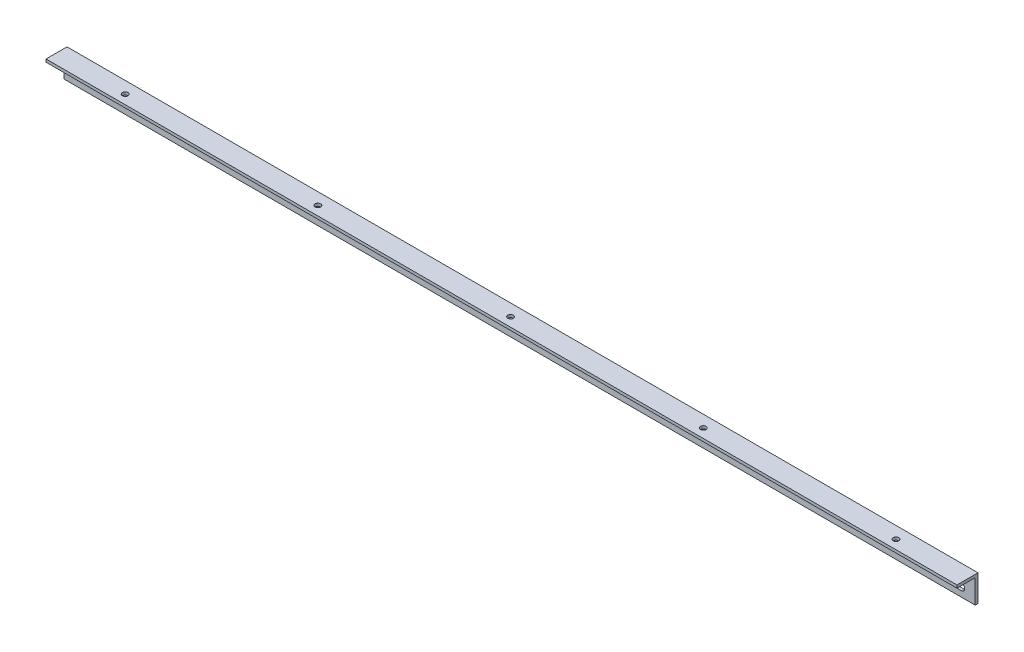
ISO-10303-21;
HEADER;
FILE_DESCRIPTION(('STEP AP214'),'2;1');
FILE_NAME('part.step','',(''),(''),'','','');
FILE_SCHEMA(('AUTOMOTIVE_DESIGN { 1 0 10303 214 1 1 1 1 }'));
ENDSEC;
DATA;
#1=APPLICATION_CONTEXT('core data for automotive mechanical design processes');
#2=APPLICATION_PROTOCOL_DEFINITION('international standard','automotive_design',2000,#1);
#3=PRODUCT_CONTEXT('',#1,'mechanical');
#4=PRODUCT('Part','Part','',(#3));
#5=PRODUCT_RELATED_PRODUCT_CATEGORY('part','',(#4));
#6=PRODUCT_DEFINITION_FORMATION('','',#4);
#7=PRODUCT_DEFINITION_CONTEXT('part definition',#1,'design');
#8=PRODUCT_DEFINITION('design','',#6,#7);
#9=PRODUCT_DEFINITION_SHAPE('','',#8);
#10=(LENGTH_UNIT() NAMED_UNIT(*) SI_UNIT(.MILLI.,.METRE.));
#11=(NAMED_UNIT(*) PLANE_ANGLE_UNIT() SI_UNIT($,.RADIAN.));
#12=(NAMED_UNIT(*) SI_UNIT($,.STERADIAN.) SOLID_ANGLE_UNIT());
#13=UNCERTAINTY_MEASURE_WITH_UNIT(LENGTH_MEASURE(1.E-05),#10,'distance_accuracy_value','');
#14=(GEOMETRIC_REPRESENTATION_CONTEXT(3) GLOBAL_UNCERTAINTY_ASSIGNED_CONTEXT((#13)) GLOBAL_UNIT_ASSIGNED_CONTEXT((#10,
#11,#12)) REPRESENTATION_CONTEXT('',''));
#15=CARTESIAN_POINT('',(0.,0.,0.));
#16=DIRECTION('',(0.,0.,1.));
#17=DIRECTION('',(1.,0.,0.));
#18=AXIS2_PLACEMENT_3D('',#15,#16,#17);
#19=CARTESIAN_POINT('',(650.,-19.,0.));
#20=DIRECTION('',(0.,0.,1.));
#21=DIRECTION('',(1.,0.,0.));
#22=AXIS2_PLACEMENT_3D('',#19,#20,#21);
#23=PLANE('',#22);
#24=DIRECTION('',(-1.,0.,0.));
#25=VECTOR('',#24,1.);
#26=CARTESIAN_POINT('',(640.,-15.,0.));
#27=LINE('',#26,#25);
#28=CARTESIAN_POINT('',(640.,-15.,0.));
#29=VERTEX_POINT('',#28);
#30=CARTESIAN_POINT('',(10.,-15.,0.));
#31=VERTEX_POINT('',#30);
#32=EDGE_CURVE('E121',#29,#31,#27,.T.);
#33=ORIENTED_EDGE('',*,*,#32,.F.);
#34=CARTESIAN_POINT('',(640.,-12.5,0.));
#35=DIRECTION('',(0.,0.,-1.));
#36=DIRECTION('',(-1.,0.,0.));
#37=AXIS2_PLACEMENT_3D('',#34,#35,#36);
#38=CIRCLE('',#37,2.5);
#39=CARTESIAN_POINT('',(640.,-10.,0.));
#40=VERTEX_POINT('',#39);
#41=EDGE_CURVE('E47',#40,#29,#38,.T.);
#42=ORIENTED_EDGE('',*,*,#41,.F.);
#43=DIRECTION('',(1.,0.,0.));
#44=VECTOR('',#43,1.);
#45=CARTESIAN_POINT('',(640.,-10.,0.));
#46=LINE('',#45,#44);
#47=CARTESIAN_POINT('',(10.,-10.,0.));
#48=VERTEX_POINT('',#47);
#49=EDGE_CURVE('E127',#48,#40,#46,.T.);
#50=ORIENTED_EDGE('',*,*,#49,.F.);
#51=CARTESIAN_POINT('',(10.,-12.5,0.));
#52=DIRECTION('',(0.,0.,-1.));
#53=DIRECTION('',(-1.,0.,0.));
#54=AXIS2_PLACEMENT_3D('',#51,#52,#53);
#55=CIRCLE('',#54,2.5);
#56=EDGE_CURVE('E112',#31,#48,#55,.T.);
#57=ORIENTED_EDGE('',*,*,#56,.F.);
#58=EDGE_LOOP('',(#33,#42,#50,#57));
#59=FACE_BOUND('',#58,.T.);
#60=DIRECTION('',(0.,1.,0.));
#61=VECTOR('',#60,1.);
#62=CARTESIAN_POINT('',(0.,-19.,0.));
#63=LINE('',#62,#61);
#64=CARTESIAN_POINT('',(0.,-19.,0.));
#65=VERTEX_POINT('',#64);
#66=CARTESIAN_POINT('',(0.,0.,0.));
#67=VERTEX_POINT('',#66);
#68=EDGE_CURVE('E138',#65,#67,#63,.T.);
#69=ORIENTED_EDGE('',*,*,#68,.T.);
#70=DIRECTION('',(-1.,0.,0.));
#71=VECTOR('',#70,1.);
#72=CARTESIAN_POINT('',(650.,0.,0.));
#73=LINE('',#72,#71);
#74=CARTESIAN_POINT('',(650.,0.,0.));
#75=VERTEX_POINT('',#74);
#76=EDGE_CURVE('E11',#75,#67,#73,.T.);
#77=ORIENTED_EDGE('',*,*,#76,.F.);
#78=DIRECTION('',(0.,1.,0.));
#79=VECTOR('',#78,1.);
#80=CARTESIAN_POINT('',(650.,-19.,0.));
#81=LINE('',#80,#79);
#82=CARTESIAN_POINT('',(650.,-19.,0.));
#83=VERTEX_POINT('',#82);
#84=EDGE_CURVE('E140',#83,#75,#81,.T.);
#85=ORIENTED_EDGE('',*,*,#84,.F.);
#86=DIRECTION('',(-1.,0.,0.));
#87=VECTOR('',#86,1.);
#88=CARTESIAN_POINT('',(650.,-19.,0.));
#89=LINE('',#88,#87);
#90=EDGE_CURVE('E154',#83,#65,#89,.T.);
#91=ORIENTED_EDGE('',*,*,#90,.T.);
#92=EDGE_LOOP('',(#69,#77,#85,#91));
#93=FACE_BOUND('',#92,.T.);
#94=ADVANCED_FACE('F33',(#59,#93),#23,.F.);
#95=CARTESIAN_POINT('',(650.,0.,0.));
#96=DIRECTION('',(0.,-1.,0.));
#97=DIRECTION('',(0.,0.,-1.));
#98=AXIS2_PLACEMENT_3D('',#95,#96,#97);
#99=PLANE('',#98);
#100=CARTESIAN_POINT('',(600.,0.,8.5));
#101=DIRECTION('',(0.,-1.,0.));
#102=DIRECTION('',(0.,0.,-1.));
#103=AXIS2_PLACEMENT_3D('',#100,#101,#102);
#104=CIRCLE('',#103,2.);
#105=CARTESIAN_POINT('',(600.,0.,6.5));
#106=VERTEX_POINT('',#105);
#107=EDGE_CURVE('E375',#106,#106,#104,.F.);
#108=ORIENTED_EDGE('',*,*,#107,.F.);
#109=EDGE_LOOP('',(#108));
#110=FACE_BOUND('',#109,.T.);
#111=CARTESIAN_POINT('',(462.5,0.,8.5));
#112=DIRECTION('',(0.,-1.,0.));
#113=DIRECTION('',(0.,0.,-1.));
#114=AXIS2_PLACEMENT_3D('',#111,#112,#113);
#115=CIRCLE('',#114,2.);
#116=CARTESIAN_POINT('',(462.5,0.,6.5));
#117=VERTEX_POINT('',#116);
#118=EDGE_CURVE('E380',#117,#117,#115,.F.);
#119=ORIENTED_EDGE('',*,*,#118,.F.);
#120=EDGE_LOOP('',(#119));
#121=FACE_BOUND('',#120,.T.);
#122=CARTESIAN_POINT('',(50.,0.,8.50000000000001));
#123=DIRECTION('',(0.,-1.,0.));
#124=DIRECTION('',(0.,0.,-1.));
#125=AXIS2_PLACEMENT_3D('',#122,#123,#124);
#126=CIRCLE('',#125,2.);
#127=CARTESIAN_POINT('',(50.,0.,6.5));
#128=VERTEX_POINT('',#127);
#129=EDGE_CURVE('E384',#128,#128,#126,.F.);
#130=ORIENTED_EDGE('',*,*,#129,.F.);
#131=EDGE_LOOP('',(#130));
#132=FACE_BOUND('',#131,.T.);
#133=CARTESIAN_POINT('',(187.5,0.,8.5));
#134=DIRECTION('',(0.,-1.,0.));
#135=DIRECTION('',(0.,0.,-1.));
#136=AXIS2_PLACEMENT_3D('',#133,#134,#135);
#137=CIRCLE('',#136,2.);
#138=CARTESIAN_POINT('',(187.5,0.,6.5));
#139=VERTEX_POINT('',#138);
#140=EDGE_CURVE('E254',#139,#139,#137,.F.);
#141=ORIENTED_EDGE('',*,*,#140,.F.);
#142=EDGE_LOOP('',(#141));
#143=FACE_BOUND('',#142,.T.);
#144=CARTESIAN_POINT('',(325.,0.,8.5));
#145=DIRECTION('',(0.,-1.,0.));
#146=DIRECTION('',(0.,0.,-1.));
#147=AXIS2_PLACEMENT_3D('',#144,#145,#146);
#148=CIRCLE('',#147,2.);
#149=CARTESIAN_POINT('',(325.,0.,6.50000000000001));
#150=VERTEX_POINT('',#149);
#151=EDGE_CURVE('E253',#150,#150,#148,.F.);
#152=ORIENTED_EDGE('',*,*,#151,.F.);
#153=EDGE_LOOP('',(#152));
#154=FACE_BOUND('',#153,.T.);
#155=DIRECTION('',(0.,0.,1.));
#156=VECTOR('',#155,1.);
#157=CARTESIAN_POINT('',(0.,0.,0.));
#158=LINE('',#157,#156);
#159=CARTESIAN_POINT('',(0.,0.,15.));
#160=VERTEX_POINT('',#159);
#161=EDGE_CURVE('E157',#67,#160,#158,.T.);
#162=ORIENTED_EDGE('',*,*,#161,.T.);
#163=DIRECTION('',(-1.,0.,0.));
#164=VECTOR('',#163,1.);
#165=CARTESIAN_POINT('',(650.,0.,15.));
#166=LINE('',#165,#164);
#167=CARTESIAN_POINT('',(650.,0.,15.));
#168=VERTEX_POINT('',#167);
#169=EDGE_CURVE('E40',#168,#160,#166,.T.);
#170=ORIENTED_EDGE('',*,*,#169,.F.);
#171=DIRECTION('',(0.,0.,1.));
#172=VECTOR('',#171,1.);
#173=CARTESIAN_POINT('',(650.,0.,0.));
#174=LINE('',#173,#172);
#175=EDGE_CURVE('E143',#75,#168,#174,.T.);
#176=ORIENTED_EDGE('',*,*,#175,.F.);
#177=ORIENTED_EDGE('',*,*,#76,.T.);
#178=EDGE_LOOP('',(#162,#170,#176,#177));
#179=FACE_BOUND('',#178,.T.);
#180=ADVANCED_FACE('F204',(#110,#121,#132,#143,#154,#179),#99,.F.);
#181=CARTESIAN_POINT('',(650.,0.,15.));
#182=DIRECTION('',(0.,0.,-1.));
#183=DIRECTION('',(-1.,0.,0.));
#184=AXIS2_PLACEMENT_3D('',#181,#182,#183);
#185=PLANE('',#184);
#186=DIRECTION('',(0.,-1.,0.));
#187=VECTOR('',#186,1.);
#188=CARTESIAN_POINT('',(0.,0.,15.));
#189=LINE('',#188,#187);
#190=CARTESIAN_POINT('',(0.,-2.,15.));
#191=VERTEX_POINT('',#190);
#192=EDGE_CURVE('E159',#160,#191,#189,.T.);
#193=ORIENTED_EDGE('',*,*,#192,.T.);
#194=DIRECTION('',(-1.,0.,0.));
#195=VECTOR('',#194,1.);
#196=CARTESIAN_POINT('',(650.,-2.,15.));
#197=LINE('',#196,#195);
#198=CARTESIAN_POINT('',(650.,-2.,15.));
#199=VERTEX_POINT('',#198);
#200=EDGE_CURVE('E174',#199,#191,#197,.T.);
#201=ORIENTED_EDGE('',*,*,#200,.F.);
#202=DIRECTION('',(0.,-1.,0.));
#203=VECTOR('',#202,1.);
#204=CARTESIAN_POINT('',(650.,0.,15.));
#205=LINE('',#204,#203);
#206=EDGE_CURVE('E146',#168,#199,#205,.T.);
#207=ORIENTED_EDGE('',*,*,#206,.F.);
#208=ORIENTED_EDGE('',*,*,#169,.T.);
#209=EDGE_LOOP('',(#193,#201,#207,#208));
#210=FACE_BOUND('',#209,.T.);
#211=ADVANCED_FACE('F181',(#210),#185,.F.);
#212=CARTESIAN_POINT('',(650.,-2.,15.));
#213=DIRECTION('',(0.,1.,0.));
#214=DIRECTION('',(0.,0.,1.));
#215=AXIS2_PLACEMENT_3D('',#212,#213,#214);
#216=PLANE('',#215);
#217=CARTESIAN_POINT('',(600.,-2.,8.5));
#218=DIRECTION('',(0.,-1.,0.));
#219=DIRECTION('',(0.,0.,-1.));
#220=AXIS2_PLACEMENT_3D('',#217,#218,#219);
#221=CIRCLE('',#220,2.);
#222=CARTESIAN_POINT('',(600.,-2.,6.5));
#223=VERTEX_POINT('',#222);
#224=EDGE_CURVE('E236',#223,#223,#221,.T.);
#225=ORIENTED_EDGE('',*,*,#224,.F.);
#226=EDGE_LOOP('',(#225));
#227=FACE_BOUND('',#226,.T.);
#228=CARTESIAN_POINT('',(462.5,-2.,8.5));
#229=DIRECTION('',(0.,-1.,0.));
#230=DIRECTION('',(0.,0.,-1.));
#231=AXIS2_PLACEMENT_3D('',#228,#229,#230);
#232=CIRCLE('',#231,2.);
#233=CARTESIAN_POINT('',(462.5,-2.,6.5));
#234=VERTEX_POINT('',#233);
#235=EDGE_CURVE('E240',#234,#234,#232,.T.);
#236=ORIENTED_EDGE('',*,*,#235,.F.);
#237=EDGE_LOOP('',(#236));
#238=FACE_BOUND('',#237,.T.);
#239=CARTESIAN_POINT('',(50.,-2.,8.50000000000001));
#240=DIRECTION('',(0.,-1.,0.));
#241=DIRECTION('',(0.,0.,-1.));
#242=AXIS2_PLACEMENT_3D('',#239,#240,#241);
#243=CIRCLE('',#242,2.);
#244=CARTESIAN_POINT('',(50.,-2.,6.5));
#245=VERTEX_POINT('',#244);
#246=EDGE_CURVE('E244',#245,#245,#243,.T.);
#247=ORIENTED_EDGE('',*,*,#246,.F.);
#248=EDGE_LOOP('',(#247));
#249=FACE_BOUND('',#248,.T.);
#250=CARTESIAN_POINT('',(187.5,-2.,8.5));
#251=DIRECTION('',(0.,-1.,0.));
#252=DIRECTION('',(0.,0.,-1.));
#253=AXIS2_PLACEMENT_3D('',#250,#251,#252);
#254=CIRCLE('',#253,2.);
#255=CARTESIAN_POINT('',(187.5,-2.,6.5));
#256=VERTEX_POINT('',#255);
#257=EDGE_CURVE('E248',#256,#256,#254,.T.);
#258=ORIENTED_EDGE('',*,*,#257,.F.);
#259=EDGE_LOOP('',(#258));
#260=FACE_BOUND('',#259,.T.);
#261=CARTESIAN_POINT('',(325.,-2.,8.5));
#262=DIRECTION('',(0.,-1.,0.));
#263=DIRECTION('',(0.,0.,-1.));
#264=AXIS2_PLACEMENT_3D('',#261,#262,#263);
#265=CIRCLE('',#264,2.);
#266=CARTESIAN_POINT('',(325.,-2.,6.50000000000001));
#267=VERTEX_POINT('',#266);
#268=EDGE_CURVE('E251',#267,#267,#265,.T.);
#269=ORIENTED_EDGE('',*,*,#268,.F.);
#270=EDGE_LOOP('',(#269));
#271=FACE_BOUND('',#270,.T.);
#272=DIRECTION('',(0.,0.,-1.));
#273=VECTOR('',#272,1.);
#274=CARTESIAN_POINT('',(0.,-2.,15.));
#275=LINE('',#274,#273);
#276=CARTESIAN_POINT('',(0.,-2.,2.));
#277=VERTEX_POINT('',#276);
#278=EDGE_CURVE('E161',#191,#277,#275,.T.);
#279=ORIENTED_EDGE('',*,*,#278,.T.);
#280=DIRECTION('',(-1.,0.,0.));
#281=VECTOR('',#280,1.);
#282=CARTESIAN_POINT('',(650.,-2.,2.));
#283=LINE('',#282,#281);
#284=CARTESIAN_POINT('',(650.,-2.,2.));
#285=VERTEX_POINT('',#284);
#286=EDGE_CURVE('E171',#285,#277,#283,.T.);
#287=ORIENTED_EDGE('',*,*,#286,.F.);
#288=DIRECTION('',(0.,0.,-1.));
#289=VECTOR('',#288,1.);
#290=CARTESIAN_POINT('',(650.,-2.,15.));
#291=LINE('',#290,#289);
#292=EDGE_CURVE('E148',#199,#285,#291,.T.);
#293=ORIENTED_EDGE('',*,*,#292,.F.);
#294=ORIENTED_EDGE('',*,*,#200,.T.);
#295=EDGE_LOOP('',(#279,#287,#293,#294));
#296=FACE_BOUND('',#295,.T.);
#297=ADVANCED_FACE('F192',(#227,#238,#249,#260,#271,#296),#216,.F.);
#298=CARTESIAN_POINT('',(650.,-2.,2.));
#299=DIRECTION('',(0.,0.,-1.));
#300=DIRECTION('',(0.,1.,0.));
#301=AXIS2_PLACEMENT_3D('',#298,#299,#300);
#302=PLANE('',#301);
#303=DIRECTION('',(-1.,0.,0.));
#304=VECTOR('',#303,1.);
#305=CARTESIAN_POINT('',(640.,-10.,2.));
#306=LINE('',#305,#304);
#307=CARTESIAN_POINT('',(640.,-10.,2.));
#308=VERTEX_POINT('',#307);
#309=CARTESIAN_POINT('',(10.,-10.,2.));
#310=VERTEX_POINT('',#309);
#311=EDGE_CURVE('E263',#308,#310,#306,.T.);
#312=ORIENTED_EDGE('',*,*,#311,.F.);
#313=CARTESIAN_POINT('',(640.,-12.5,2.));
#314=DIRECTION('',(0.,0.,-1.));
#315=DIRECTION('',(0.,1.,0.));
#316=AXIS2_PLACEMENT_3D('',#313,#314,#315);
#317=CIRCLE('',#316,2.5);
#318=CARTESIAN_POINT('',(640.,-15.,2.));
#319=VERTEX_POINT('',#318);
#320=EDGE_CURVE('E139',#319,#308,#317,.F.);
#321=ORIENTED_EDGE('',*,*,#320,.F.);
#322=DIRECTION('',(1.,0.,0.));
#323=VECTOR('',#322,1.);
#324=CARTESIAN_POINT('',(640.,-15.,2.));
#325=LINE('',#324,#323);
#326=CARTESIAN_POINT('',(10.,-15.,2.));
#327=VERTEX_POINT('',#326);
#328=EDGE_CURVE('E136',#327,#319,#325,.T.);
#329=ORIENTED_EDGE('',*,*,#328,.F.);
#330=CARTESIAN_POINT('',(10.,-12.5,2.));
#331=DIRECTION('',(0.,0.,-1.));
#332=DIRECTION('',(0.,1.,0.));
#333=AXIS2_PLACEMENT_3D('',#330,#331,#332);
#334=CIRCLE('',#333,2.5);
#335=EDGE_CURVE('E115',#310,#327,#334,.F.);
#336=ORIENTED_EDGE('',*,*,#335,.F.);
#337=EDGE_LOOP('',(#312,#321,#329,#336));
#338=FACE_BOUND('',#337,.T.);
#339=DIRECTION('',(0.,-1.,0.));
#340=VECTOR('',#339,1.);
#341=CARTESIAN_POINT('',(0.,-2.,2.));
#342=LINE('',#341,#340);
#343=CARTESIAN_POINT('',(0.,-19.,2.));
#344=VERTEX_POINT('',#343);
#345=EDGE_CURVE('E163',#277,#344,#342,.T.);
#346=ORIENTED_EDGE('',*,*,#345,.T.);
#347=DIRECTION('',(-1.,0.,0.));
#348=VECTOR('',#347,1.);
#349=CARTESIAN_POINT('',(650.,-19.,2.));
#350=LINE('',#349,#348);
#351=CARTESIAN_POINT('',(650.,-19.,2.));
#352=VERTEX_POINT('',#351);
#353=EDGE_CURVE('E168',#352,#344,#350,.T.);
#354=ORIENTED_EDGE('',*,*,#353,.F.);
#355=DIRECTION('',(0.,-1.,0.));
#356=VECTOR('',#355,1.);
#357=CARTESIAN_POINT('',(650.,-2.,2.));
#358=LINE('',#357,#356);
#359=EDGE_CURVE('E150',#285,#352,#358,.T.);
#360=ORIENTED_EDGE('',*,*,#359,.F.);
#361=ORIENTED_EDGE('',*,*,#286,.T.);
#362=EDGE_LOOP('',(#346,#354,#360,#361));
#363=FACE_BOUND('',#362,.T.);
#364=ADVANCED_FACE('F196',(#338,#363),#302,.F.);
#365=CARTESIAN_POINT('',(650.,-19.,2.));
#366=DIRECTION('',(0.,1.,0.));
#367=DIRECTION('',(0.,0.,1.));
#368=AXIS2_PLACEMENT_3D('',#365,#366,#367);
#369=PLANE('',#368);
#370=DIRECTION('',(0.,0.,-1.));
#371=VECTOR('',#370,1.);
#372=CARTESIAN_POINT('',(0.,-19.,2.));
#373=LINE('',#372,#371);
#374=EDGE_CURVE('E144',#344,#65,#373,.T.);
#375=ORIENTED_EDGE('',*,*,#374,.T.);
#376=ORIENTED_EDGE('',*,*,#90,.F.);
#377=DIRECTION('',(0.,0.,-1.));
#378=VECTOR('',#377,1.);
#379=CARTESIAN_POINT('',(650.,-19.,2.));
#380=LINE('',#379,#378);
#381=EDGE_CURVE('E152',#352,#83,#380,.T.);
#382=ORIENTED_EDGE('',*,*,#381,.F.);
#383=ORIENTED_EDGE('',*,*,#353,.T.);
#384=EDGE_LOOP('',(#375,#376,#382,#383));
#385=FACE_BOUND('',#384,.T.);
#386=ADVANCED_FACE('F206',(#385),#369,.F.);
#387=CARTESIAN_POINT('',(650.,0.,0.));
#388=DIRECTION('',(1.,0.,0.));
#389=DIRECTION('',(0.,0.,-1.));
#390=AXIS2_PLACEMENT_3D('',#387,#388,#389);
#391=PLANE('',#390);
#392=ORIENTED_EDGE('',*,*,#84,.T.);
#393=ORIENTED_EDGE('',*,*,#175,.T.);
#394=ORIENTED_EDGE('',*,*,#206,.T.);
#395=ORIENTED_EDGE('',*,*,#292,.T.);
#396=ORIENTED_EDGE('',*,*,#359,.T.);
#397=ORIENTED_EDGE('',*,*,#381,.T.);
#398=EDGE_LOOP('',(#392,#393,#394,#395,#396,#397));
#399=FACE_BOUND('',#398,.T.);
#400=ADVANCED_FACE('F200',(#399),#391,.T.);
#401=CARTESIAN_POINT('',(0.,0.,0.));
#402=DIRECTION('',(1.,0.,0.));
#403=DIRECTION('',(0.,0.,-1.));
#404=AXIS2_PLACEMENT_3D('',#401,#402,#403);
#405=PLANE('',#404);
#406=ORIENTED_EDGE('',*,*,#68,.F.);
#407=ORIENTED_EDGE('',*,*,#374,.F.);
#408=ORIENTED_EDGE('',*,*,#345,.F.);
#409=ORIENTED_EDGE('',*,*,#278,.F.);
#410=ORIENTED_EDGE('',*,*,#192,.F.);
#411=ORIENTED_EDGE('',*,*,#161,.F.);
#412=EDGE_LOOP('',(#406,#407,#408,#409,#410,#411));
#413=FACE_BOUND('',#412,.T.);
#414=ADVANCED_FACE('F187',(#413),#405,.F.);
#415=CARTESIAN_POINT('',(640.,-12.5,637.019684734261));
#416=DIRECTION('',(0.,0.,-1.));
#417=DIRECTION('',(-1.,0.,0.));
#418=AXIS2_PLACEMENT_3D('',#415,#416,#417);
#419=CYLINDRICAL_SURFACE('',#418,2.5);
#420=ORIENTED_EDGE('',*,*,#320,.T.);
#421=DIRECTION('',(0.,0.,-1.));
#422=VECTOR('',#421,1.);
#423=CARTESIAN_POINT('',(640.,-10.,637.019684734261));
#424=LINE('',#423,#422);
#425=EDGE_CURVE('E132',#308,#40,#424,.T.);
#426=ORIENTED_EDGE('',*,*,#425,.T.);
#427=ORIENTED_EDGE('',*,*,#41,.T.);
#428=DIRECTION('',(0.,0.,-1.));
#429=VECTOR('',#428,1.);
#430=CARTESIAN_POINT('',(640.,-15.,637.019684734261));
#431=LINE('',#430,#429);
#432=EDGE_CURVE('E118',#319,#29,#431,.T.);
#433=ORIENTED_EDGE('',*,*,#432,.F.);
#434=EDGE_LOOP('',(#420,#426,#427,#433));
#435=FACE_BOUND('',#434,.T.);
#436=ADVANCED_FACE('F267',(#435),#419,.F.);
#437=CARTESIAN_POINT('',(640.,-10.,637.019684734261));
#438=DIRECTION('',(0.,1.,0.));
#439=DIRECTION('',(0.,0.,1.));
#440=AXIS2_PLACEMENT_3D('',#437,#438,#439);
#441=PLANE('',#440);
#442=ORIENTED_EDGE('',*,*,#311,.T.);
#443=DIRECTION('',(0.,0.,-1.));
#444=VECTOR('',#443,1.);
#445=CARTESIAN_POINT('',(10.,-10.,637.019684734261));
#446=LINE('',#445,#444);
#447=EDGE_CURVE('E117',#310,#48,#446,.T.);
#448=ORIENTED_EDGE('',*,*,#447,.T.);
#449=ORIENTED_EDGE('',*,*,#49,.T.);
#450=ORIENTED_EDGE('',*,*,#425,.F.);
#451=EDGE_LOOP('',(#442,#448,#449,#450));
#452=FACE_BOUND('',#451,.T.);
#453=ADVANCED_FACE('F270',(#452),#441,.F.);
#454=CARTESIAN_POINT('',(10.,-12.5,637.019684734261));
#455=DIRECTION('',(0.,0.,-1.));
#456=DIRECTION('',(-1.,0.,0.));
#457=AXIS2_PLACEMENT_3D('',#454,#455,#456);
#458=CYLINDRICAL_SURFACE('',#457,2.5);
#459=ORIENTED_EDGE('',*,*,#335,.T.);
#460=DIRECTION('',(0.,0.,-1.));
#461=VECTOR('',#460,1.);
#462=CARTESIAN_POINT('',(10.,-15.,637.019684734261));
#463=LINE('',#462,#461);
#464=EDGE_CURVE('E55',#327,#31,#463,.T.);
#465=ORIENTED_EDGE('',*,*,#464,.T.);
#466=ORIENTED_EDGE('',*,*,#56,.T.);
#467=ORIENTED_EDGE('',*,*,#447,.F.);
#468=EDGE_LOOP('',(#459,#465,#466,#467));
#469=FACE_BOUND('',#468,.T.);
#470=ADVANCED_FACE('F109',(#469),#458,.F.);
#471=CARTESIAN_POINT('',(640.,-15.,637.019684734261));
#472=DIRECTION('',(0.,-1.,0.));
#473=DIRECTION('',(0.,0.,-1.));
#474=AXIS2_PLACEMENT_3D('',#471,#472,#473);
#475=PLANE('',#474);
#476=ORIENTED_EDGE('',*,*,#328,.T.);
#477=ORIENTED_EDGE('',*,*,#432,.T.);
#478=ORIENTED_EDGE('',*,*,#32,.T.);
#479=ORIENTED_EDGE('',*,*,#464,.F.);
#480=EDGE_LOOP('',(#476,#477,#478,#479));
#481=FACE_BOUND('',#480,.T.);
#482=ADVANCED_FACE('F122',(#481),#475,.F.);
#483=CARTESIAN_POINT('',(325.,5.65685424949239,8.5));
#484=DIRECTION('',(0.,-1.,0.));
#485=DIRECTION('',(0.,0.,-1.));
#486=AXIS2_PLACEMENT_3D('',#483,#484,#485);
#487=CYLINDRICAL_SURFACE('',#486,2.);
#488=CARTESIAN_POINT('',(325.,0.,6.50000000000001));
#489=CARTESIAN_POINT('',(325.,-0.0208333333333325,6.50000000000001));
#490=CARTESIAN_POINT('',(325.,-0.0416666666666658,6.50000000000001));
#491=CARTESIAN_POINT('',(325.,-0.0833333333333326,6.50000000000001));
#492=CARTESIAN_POINT('',(325.,-0.104166666666666,6.50000000000001));
#493=CARTESIAN_POINT('',(325.,-0.145833333333333,6.50000000000001));
#494=CARTESIAN_POINT('',(325.,-0.166666666666666,6.50000000000001));
#495=CARTESIAN_POINT('',(325.,-0.208333333333333,6.50000000000001));
#496=CARTESIAN_POINT('',(325.,-0.229166666666666,6.50000000000001));
#497=CARTESIAN_POINT('',(325.,-0.270833333333333,6.50000000000001));
#498=CARTESIAN_POINT('',(325.,-0.291666666666666,6.50000000000001));
#499=CARTESIAN_POINT('',(325.,-0.333333333333333,6.50000000000001));
#500=CARTESIAN_POINT('',(325.,-0.354166666666666,6.50000000000001));
#501=CARTESIAN_POINT('',(325.,-0.395833333333333,6.50000000000001));
#502=CARTESIAN_POINT('',(325.,-0.416666666666666,6.50000000000001));
#503=CARTESIAN_POINT('',(325.,-0.458333333333333,6.50000000000001));
#504=CARTESIAN_POINT('',(325.,-0.479166666666666,6.50000000000001));
#505=CARTESIAN_POINT('',(325.,-0.520833333333333,6.50000000000001));
#506=CARTESIAN_POINT('',(325.,-0.541666666666666,6.50000000000001));
#507=CARTESIAN_POINT('',(325.,-0.583333333333333,6.50000000000001));
#508=CARTESIAN_POINT('',(325.,-0.604166666666666,6.50000000000001));
#509=CARTESIAN_POINT('',(325.,-0.645833333333333,6.50000000000001));
#510=CARTESIAN_POINT('',(325.,-0.666666666666666,6.50000000000001));
#511=CARTESIAN_POINT('',(325.,-0.708333333333333,6.50000000000001));
#512=CARTESIAN_POINT('',(325.,-0.729166666666667,6.50000000000001));
#513=CARTESIAN_POINT('',(325.,-0.770833333333333,6.50000000000001));
#514=CARTESIAN_POINT('',(325.,-0.791666666666667,6.50000000000001));
#515=CARTESIAN_POINT('',(325.,-0.833333333333333,6.50000000000001));
#516=CARTESIAN_POINT('',(325.,-0.854166666666667,6.50000000000001));
#517=CARTESIAN_POINT('',(325.,-0.895833333333333,6.50000000000001));
#518=CARTESIAN_POINT('',(325.,-0.916666666666667,6.50000000000001));
#519=CARTESIAN_POINT('',(325.,-0.958333333333333,6.50000000000001));
#520=CARTESIAN_POINT('',(325.,-0.979166666666667,6.50000000000001));
#521=CARTESIAN_POINT('',(325.,-1.02083333333333,6.50000000000001));
#522=CARTESIAN_POINT('',(325.,-1.04166666666667,6.50000000000001));
#523=CARTESIAN_POINT('',(325.,-1.08333333333333,6.50000000000001));
#524=CARTESIAN_POINT('',(325.,-1.10416666666667,6.50000000000001));
#525=CARTESIAN_POINT('',(325.,-1.14583333333333,6.50000000000001));
#526=CARTESIAN_POINT('',(325.,-1.16666666666667,6.50000000000001));
#527=CARTESIAN_POINT('',(325.,-1.20833333333333,6.50000000000001));
#528=CARTESIAN_POINT('',(325.,-1.22916666666667,6.50000000000001));
#529=CARTESIAN_POINT('',(325.,-1.27083333333333,6.50000000000001));
#530=CARTESIAN_POINT('',(325.,-1.29166666666667,6.50000000000001));
#531=CARTESIAN_POINT('',(325.,-1.33333333333333,6.50000000000001));
#532=CARTESIAN_POINT('',(325.,-1.35416666666667,6.50000000000001));
#533=CARTESIAN_POINT('',(325.,-1.39583333333333,6.50000000000001));
#534=CARTESIAN_POINT('',(325.,-1.41666666666667,6.50000000000001));
#535=CARTESIAN_POINT('',(325.,-1.45833333333333,6.50000000000001));
#536=CARTESIAN_POINT('',(325.,-1.47916666666667,6.50000000000001));
#537=CARTESIAN_POINT('',(325.,-1.52083333333333,6.50000000000001));
#538=CARTESIAN_POINT('',(325.,-1.54166666666667,6.50000000000001));
#539=CARTESIAN_POINT('',(325.,-1.58333333333333,6.50000000000001));
#540=CARTESIAN_POINT('',(325.,-1.60416666666667,6.50000000000001));
#541=CARTESIAN_POINT('',(325.,-1.64583333333333,6.50000000000001));
#542=CARTESIAN_POINT('',(325.,-1.66666666666667,6.50000000000001));
#543=CARTESIAN_POINT('',(325.,-1.70833333333333,6.50000000000001));
#544=CARTESIAN_POINT('',(325.,-1.72916666666667,6.50000000000001));
#545=CARTESIAN_POINT('',(325.,-1.77083333333333,6.50000000000001));
#546=CARTESIAN_POINT('',(325.,-1.79166666666667,6.50000000000001));
#547=CARTESIAN_POINT('',(325.,-1.83333333333333,6.50000000000001));
#548=CARTESIAN_POINT('',(325.,-1.85416666666667,6.50000000000001));
#549=CARTESIAN_POINT('',(325.,-1.89583333333333,6.50000000000001));
#550=CARTESIAN_POINT('',(325.,-1.91666666666667,6.50000000000001));
#551=CARTESIAN_POINT('',(325.,-1.95833333333333,6.50000000000001));
#552=CARTESIAN_POINT('',(325.,-1.97916666666667,6.50000000000001));
#553=CARTESIAN_POINT('',(325.,-2.,6.50000000000001));
#554=B_SPLINE_CURVE_WITH_KNOTS('',3,(#488,#489,#490,#491,#492,#493,#494,#495,#496,#497,#498,
#499,#500,#501,#502,#503,#504,#505,#506,#507,#508,#509,#510,#511,#512,#513,#514,#515,#516,#517,
#518,#519,#520,#521,#522,#523,#524,#525,#526,#527,#528,#529,#530,#531,#532,#533,#534,#535,#536,
#537,#538,#539,#540,#541,#542,#543,#544,#545,#546,#547,#548,#549,#550,#551,#552,#553),
.UNSPECIFIED.,.F.,.F.,(4,2,2,2,2,2,2,2,2,2,2,2,2,2,2,2,2,2,2,2,2,2,2,2,2,2,2,2,2,2,2,2,4),(0.,
0.0625000000000001,0.125,0.1875,0.25,0.3125,0.375,0.4375,0.5,0.5625,0.625000000000001,
0.687500000000001,0.750000000000001,0.812500000000001,0.875000000000001,0.937500000000001,1.,
1.0625,1.125,1.1875,1.25,1.3125,1.375,1.4375,1.5,1.5625,1.625,1.6875,1.75,1.8125,1.875,1.9375,
2.),.UNSPECIFIED.);
#555=EDGE_CURVE('BSEAM280',#150,#267,#554,.T.);
#556=ORIENTED_EDGE('',*,*,#151,.T.);
#557=ORIENTED_EDGE('',*,*,#268,.T.);
#558=ORIENTED_EDGE('',*,*,#555,.T.);
#559=ORIENTED_EDGE('',*,*,#555,.F.);
#560=EDGE_LOOP('',(#556,#558,#557,#559));
#561=FACE_BOUND('',#560,.T.);
#562=ADVANCED_FACE('F280',(#561),#487,.F.);
#563=CARTESIAN_POINT('',(187.5,5.65685424949239,8.5));
#564=DIRECTION('',(0.,-1.,0.));
#565=DIRECTION('',(0.,0.,-1.));
#566=AXIS2_PLACEMENT_3D('',#563,#564,#565);
#567=CYLINDRICAL_SURFACE('',#566,2.);
#568=CARTESIAN_POINT('',(187.5,0.,6.5));
#569=CARTESIAN_POINT('',(187.5,-0.0208333333333325,6.5));
#570=CARTESIAN_POINT('',(187.5,-0.0416666666666658,6.5));
#571=CARTESIAN_POINT('',(187.5,-0.0833333333333326,6.5));
#572=CARTESIAN_POINT('',(187.5,-0.104166666666666,6.5));
#573=CARTESIAN_POINT('',(187.5,-0.145833333333333,6.5));
#574=CARTESIAN_POINT('',(187.5,-0.166666666666666,6.5));
#575=CARTESIAN_POINT('',(187.5,-0.208333333333333,6.5));
#576=CARTESIAN_POINT('',(187.5,-0.229166666666666,6.5));
#577=CARTESIAN_POINT('',(187.5,-0.270833333333333,6.5));
#578=CARTESIAN_POINT('',(187.5,-0.291666666666666,6.5));
#579=CARTESIAN_POINT('',(187.5,-0.333333333333333,6.5));
#580=CARTESIAN_POINT('',(187.5,-0.354166666666666,6.5));
#581=CARTESIAN_POINT('',(187.5,-0.395833333333333,6.5));
#582=CARTESIAN_POINT('',(187.5,-0.416666666666666,6.5));
#583=CARTESIAN_POINT('',(187.5,-0.458333333333333,6.5));
#584=CARTESIAN_POINT('',(187.5,-0.479166666666666,6.5));
#585=CARTESIAN_POINT('',(187.5,-0.520833333333333,6.5));
#586=CARTESIAN_POINT('',(187.5,-0.541666666666666,6.5));
#587=CARTESIAN_POINT('',(187.5,-0.583333333333333,6.5));
#588=CARTESIAN_POINT('',(187.5,-0.604166666666666,6.5));
#589=CARTESIAN_POINT('',(187.5,-0.645833333333333,6.5));
#590=CARTESIAN_POINT('',(187.5,-0.666666666666666,6.5));
#591=CARTESIAN_POINT('',(187.5,-0.708333333333333,6.5));
#592=CARTESIAN_POINT('',(187.5,-0.729166666666667,6.5));
#593=CARTESIAN_POINT('',(187.5,-0.770833333333333,6.5));
#594=CARTESIAN_POINT('',(187.5,-0.791666666666667,6.5));
#595=CARTESIAN_POINT('',(187.5,-0.833333333333333,6.5));
#596=CARTESIAN_POINT('',(187.5,-0.854166666666667,6.5));
#597=CARTESIAN_POINT('',(187.5,-0.895833333333333,6.5));
#598=CARTESIAN_POINT('',(187.5,-0.916666666666667,6.5));
#599=CARTESIAN_POINT('',(187.5,-0.958333333333333,6.5));
#600=CARTESIAN_POINT('',(187.5,-0.979166666666667,6.5));
#601=CARTESIAN_POINT('',(187.5,-1.02083333333333,6.5));
#602=CARTESIAN_POINT('',(187.5,-1.04166666666667,6.5));
#603=CARTESIAN_POINT('',(187.5,-1.08333333333333,6.5));
#604=CARTESIAN_POINT('',(187.5,-1.10416666666667,6.5));
#605=CARTESIAN_POINT('',(187.5,-1.14583333333333,6.5));
#606=CARTESIAN_POINT('',(187.5,-1.16666666666667,6.5));
#607=CARTESIAN_POINT('',(187.5,-1.20833333333333,6.5));
#608=CARTESIAN_POINT('',(187.5,-1.22916666666667,6.5));
#609=CARTESIAN_POINT('',(187.5,-1.27083333333333,6.5));
#610=CARTESIAN_POINT('',(187.5,-1.29166666666667,6.5));
#611=CARTESIAN_POINT('',(187.5,-1.33333333333333,6.5));
#612=CARTESIAN_POINT('',(187.5,-1.35416666666667,6.5));
#613=CARTESIAN_POINT('',(187.5,-1.39583333333333,6.5));
#614=CARTESIAN_POINT('',(187.5,-1.41666666666667,6.5));
#615=CARTESIAN_POINT('',(187.5,-1.45833333333333,6.5));
#616=CARTESIAN_POINT('',(187.5,-1.47916666666667,6.5));
#617=CARTESIAN_POINT('',(187.5,-1.52083333333333,6.5));
#618=CARTESIAN_POINT('',(187.5,-1.54166666666667,6.5));
#619=CARTESIAN_POINT('',(187.5,-1.58333333333333,6.5));
#620=CARTESIAN_POINT('',(187.5,-1.60416666666667,6.5));
#621=CARTESIAN_POINT('',(187.5,-1.64583333333333,6.5));
#622=CARTESIAN_POINT('',(187.5,-1.66666666666667,6.5));
#623=CARTESIAN_POINT('',(187.5,-1.70833333333333,6.5));
#624=CARTESIAN_POINT('',(187.5,-1.72916666666667,6.5));
#625=CARTESIAN_POINT('',(187.5,-1.77083333333333,6.5));
#626=CARTESIAN_POINT('',(187.5,-1.79166666666667,6.5));
#627=CARTESIAN_POINT('',(187.5,-1.83333333333333,6.5));
#628=CARTESIAN_POINT('',(187.5,-1.85416666666667,6.5));
#629=CARTESIAN_POINT('',(187.5,-1.89583333333333,6.5));
#630=CARTESIAN_POINT('',(187.5,-1.91666666666667,6.5));
#631=CARTESIAN_POINT('',(187.5,-1.95833333333333,6.5));
#632=CARTESIAN_POINT('',(187.5,-1.97916666666667,6.5));
#633=CARTESIAN_POINT('',(187.5,-2.,6.5));
#634=B_SPLINE_CURVE_WITH_KNOTS('',3,(#568,#569,#570,#571,#572,#573,#574,#575,#576,#577,#578,
#579,#580,#581,#582,#583,#584,#585,#586,#587,#588,#589,#590,#591,#592,#593,#594,#595,#596,#597,
#598,#599,#600,#601,#602,#603,#604,#605,#606,#607,#608,#609,#610,#611,#612,#613,#614,#615,#616,
#617,#618,#619,#620,#621,#622,#623,#624,#625,#626,#627,#628,#629,#630,#631,#632,#633),
.UNSPECIFIED.,.F.,.F.,(4,2,2,2,2,2,2,2,2,2,2,2,2,2,2,2,2,2,2,2,2,2,2,2,2,2,2,2,2,2,2,2,4),(0.,
0.0625000000000001,0.125,0.1875,0.25,0.3125,0.375,0.4375,0.5,0.5625,0.625000000000001,
0.687500000000001,0.750000000000001,0.812500000000001,0.875000000000001,0.937500000000001,1.,
1.0625,1.125,1.1875,1.25,1.3125,1.375,1.4375,1.5,1.5625,1.625,1.6875,1.75,1.8125,1.875,1.9375,
2.),.UNSPECIFIED.);
#635=EDGE_CURVE('BSEAM331',#139,#256,#634,.T.);
#636=ORIENTED_EDGE('',*,*,#140,.T.);
#637=ORIENTED_EDGE('',*,*,#257,.T.);
#638=ORIENTED_EDGE('',*,*,#635,.T.);
#639=ORIENTED_EDGE('',*,*,#635,.F.);
#640=EDGE_LOOP('',(#636,#638,#637,#639));
#641=FACE_BOUND('',#640,.T.);
#642=ADVANCED_FACE('F331',(#641),#567,.F.);
#643=CARTESIAN_POINT('',(50.,5.65685424949239,8.50000000000001));
#644=DIRECTION('',(0.,-1.,0.));
#645=DIRECTION('',(0.,0.,-1.));
#646=AXIS2_PLACEMENT_3D('',#643,#644,#645);
#647=CYLINDRICAL_SURFACE('',#646,2.);
#648=CARTESIAN_POINT('',(50.,0.,6.5));
#649=CARTESIAN_POINT('',(50.,-0.0208333333333325,6.5));
#650=CARTESIAN_POINT('',(50.,-0.0416666666666658,6.5));
#651=CARTESIAN_POINT('',(50.,-0.0833333333333326,6.5));
#652=CARTESIAN_POINT('',(50.,-0.104166666666666,6.5));
#653=CARTESIAN_POINT('',(50.,-0.145833333333333,6.5));
#654=CARTESIAN_POINT('',(50.,-0.166666666666666,6.5));
#655=CARTESIAN_POINT('',(50.,-0.208333333333333,6.5));
#656=CARTESIAN_POINT('',(50.,-0.229166666666666,6.5));
#657=CARTESIAN_POINT('',(50.,-0.270833333333333,6.5));
#658=CARTESIAN_POINT('',(50.,-0.291666666666666,6.5));
#659=CARTESIAN_POINT('',(50.,-0.333333333333333,6.5));
#660=CARTESIAN_POINT('',(50.,-0.354166666666666,6.5));
#661=CARTESIAN_POINT('',(50.,-0.395833333333333,6.5));
#662=CARTESIAN_POINT('',(50.,-0.416666666666666,6.5));
#663=CARTESIAN_POINT('',(50.,-0.458333333333333,6.5));
#664=CARTESIAN_POINT('',(50.,-0.479166666666666,6.5));
#665=CARTESIAN_POINT('',(50.,-0.520833333333333,6.5));
#666=CARTESIAN_POINT('',(50.,-0.541666666666666,6.5));
#667=CARTESIAN_POINT('',(50.,-0.583333333333333,6.5));
#668=CARTESIAN_POINT('',(50.,-0.604166666666666,6.5));
#669=CARTESIAN_POINT('',(50.,-0.645833333333333,6.5));
#670=CARTESIAN_POINT('',(50.,-0.666666666666666,6.5));
#671=CARTESIAN_POINT('',(50.,-0.708333333333333,6.5));
#672=CARTESIAN_POINT('',(50.,-0.729166666666667,6.5));
#673=CARTESIAN_POINT('',(50.,-0.770833333333333,6.5));
#674=CARTESIAN_POINT('',(50.,-0.791666666666667,6.5));
#675=CARTESIAN_POINT('',(50.,-0.833333333333333,6.5));
#676=CARTESIAN_POINT('',(50.,-0.854166666666667,6.5));
#677=CARTESIAN_POINT('',(50.,-0.895833333333333,6.5));
#678=CARTESIAN_POINT('',(50.,-0.916666666666667,6.5));
#679=CARTESIAN_POINT('',(50.,-0.958333333333333,6.5));
#680=CARTESIAN_POINT('',(50.,-0.979166666666667,6.5));
#681=CARTESIAN_POINT('',(50.,-1.02083333333333,6.5));
#682=CARTESIAN_POINT('',(50.,-1.04166666666667,6.5));
#683=CARTESIAN_POINT('',(50.,-1.08333333333333,6.5));
#684=CARTESIAN_POINT('',(50.,-1.10416666666667,6.5));
#685=CARTESIAN_POINT('',(50.,-1.14583333333333,6.5));
#686=CARTESIAN_POINT('',(50.,-1.16666666666667,6.5));
#687=CARTESIAN_POINT('',(50.,-1.20833333333333,6.5));
#688=CARTESIAN_POINT('',(50.,-1.22916666666667,6.5));
#689=CARTESIAN_POINT('',(50.,-1.27083333333333,6.5));
#690=CARTESIAN_POINT('',(50.,-1.29166666666667,6.5));
#691=CARTESIAN_POINT('',(50.,-1.33333333333333,6.5));
#692=CARTESIAN_POINT('',(50.,-1.35416666666667,6.5));
#693=CARTESIAN_POINT('',(50.,-1.39583333333333,6.5));
#694=CARTESIAN_POINT('',(50.,-1.41666666666667,6.5));
#695=CARTESIAN_POINT('',(50.,-1.45833333333333,6.5));
#696=CARTESIAN_POINT('',(50.,-1.47916666666667,6.5));
#697=CARTESIAN_POINT('',(50.,-1.52083333333333,6.5));
#698=CARTESIAN_POINT('',(50.,-1.54166666666667,6.5));
#699=CARTESIAN_POINT('',(50.,-1.58333333333333,6.5));
#700=CARTESIAN_POINT('',(50.,-1.60416666666667,6.5));
#701=CARTESIAN_POINT('',(50.,-1.64583333333333,6.5));
#702=CARTESIAN_POINT('',(50.,-1.66666666666667,6.5));
#703=CARTESIAN_POINT('',(50.,-1.70833333333333,6.5));
#704=CARTESIAN_POINT('',(50.,-1.72916666666667,6.5));
#705=CARTESIAN_POINT('',(50.,-1.77083333333333,6.5));
#706=CARTESIAN_POINT('',(50.,-1.79166666666667,6.5));
#707=CARTESIAN_POINT('',(50.,-1.83333333333333,6.5));
#708=CARTESIAN_POINT('',(50.,-1.85416666666667,6.5));
#709=CARTESIAN_POINT('',(50.,-1.89583333333333,6.5));
#710=CARTESIAN_POINT('',(50.,-1.91666666666667,6.5));
#711=CARTESIAN_POINT('',(50.,-1.95833333333333,6.5));
#712=CARTESIAN_POINT('',(50.,-1.97916666666667,6.5));
#713=CARTESIAN_POINT('',(50.,-2.,6.5));
#714=B_SPLINE_CURVE_WITH_KNOTS('',3,(#648,#649,#650,#651,#652,#653,#654,#655,#656,#657,#658,
#659,#660,#661,#662,#663,#664,#665,#666,#667,#668,#669,#670,#671,#672,#673,#674,#675,#676,#677,
#678,#679,#680,#681,#682,#683,#684,#685,#686,#687,#688,#689,#690,#691,#692,#693,#694,#695,#696,
#697,#698,#699,#700,#701,#702,#703,#704,#705,#706,#707,#708,#709,#710,#711,#712,#713),
.UNSPECIFIED.,.F.,.F.,(4,2,2,2,2,2,2,2,2,2,2,2,2,2,2,2,2,2,2,2,2,2,2,2,2,2,2,2,2,2,2,2,4),(0.,
0.0625000000000001,0.125,0.1875,0.25,0.3125,0.375,0.4375,0.5,0.5625,0.625000000000001,
0.687500000000001,0.750000000000001,0.812500000000001,0.875000000000001,0.937500000000001,1.,
1.0625,1.125,1.1875,1.25,1.3125,1.375,1.4375,1.5,1.5625,1.625,1.6875,1.75,1.8125,1.875,1.9375,
2.),.UNSPECIFIED.);
#715=EDGE_CURVE('BSEAM340',#128,#245,#714,.T.);
#716=ORIENTED_EDGE('',*,*,#129,.T.);
#717=ORIENTED_EDGE('',*,*,#246,.T.);
#718=ORIENTED_EDGE('',*,*,#715,.T.);
#719=ORIENTED_EDGE('',*,*,#715,.F.);
#720=EDGE_LOOP('',(#716,#718,#717,#719));
#721=FACE_BOUND('',#720,.T.);
#722=ADVANCED_FACE('F340',(#721),#647,.F.);
#723=CARTESIAN_POINT('',(462.5,5.65685424949239,8.5));
#724=DIRECTION('',(0.,-1.,0.));
#725=DIRECTION('',(0.,0.,-1.));
#726=AXIS2_PLACEMENT_3D('',#723,#724,#725);
#727=CYLINDRICAL_SURFACE('',#726,2.);
#728=CARTESIAN_POINT('',(462.5,0.,6.5));
#729=CARTESIAN_POINT('',(462.5,-0.0208333333333325,6.5));
#730=CARTESIAN_POINT('',(462.5,-0.0416666666666658,6.5));
#731=CARTESIAN_POINT('',(462.5,-0.0833333333333326,6.5));
#732=CARTESIAN_POINT('',(462.5,-0.104166666666666,6.5));
#733=CARTESIAN_POINT('',(462.5,-0.145833333333333,6.5));
#734=CARTESIAN_POINT('',(462.5,-0.166666666666666,6.5));
#735=CARTESIAN_POINT('',(462.5,-0.208333333333333,6.5));
#736=CARTESIAN_POINT('',(462.5,-0.229166666666666,6.5));
#737=CARTESIAN_POINT('',(462.5,-0.270833333333333,6.5));
#738=CARTESIAN_POINT('',(462.5,-0.291666666666666,6.5));
#739=CARTESIAN_POINT('',(462.5,-0.333333333333333,6.5));
#740=CARTESIAN_POINT('',(462.5,-0.354166666666666,6.5));
#741=CARTESIAN_POINT('',(462.5,-0.395833333333333,6.5));
#742=CARTESIAN_POINT('',(462.5,-0.416666666666666,6.5));
#743=CARTESIAN_POINT('',(462.5,-0.458333333333333,6.5));
#744=CARTESIAN_POINT('',(462.5,-0.479166666666666,6.5));
#745=CARTESIAN_POINT('',(462.5,-0.520833333333333,6.5));
#746=CARTESIAN_POINT('',(462.5,-0.541666666666666,6.5));
#747=CARTESIAN_POINT('',(462.5,-0.583333333333333,6.5));
#748=CARTESIAN_POINT('',(462.5,-0.604166666666666,6.5));
#749=CARTESIAN_POINT('',(462.5,-0.645833333333333,6.5));
#750=CARTESIAN_POINT('',(462.5,-0.666666666666666,6.5));
#751=CARTESIAN_POINT('',(462.5,-0.708333333333333,6.5));
#752=CARTESIAN_POINT('',(462.5,-0.729166666666667,6.5));
#753=CARTESIAN_POINT('',(462.5,-0.770833333333333,6.5));
#754=CARTESIAN_POINT('',(462.5,-0.791666666666667,6.5));
#755=CARTESIAN_POINT('',(462.5,-0.833333333333333,6.5));
#756=CARTESIAN_POINT('',(462.5,-0.854166666666667,6.5));
#757=CARTESIAN_POINT('',(462.5,-0.895833333333333,6.5));
#758=CARTESIAN_POINT('',(462.5,-0.916666666666667,6.5));
#759=CARTESIAN_POINT('',(462.5,-0.958333333333333,6.5));
#760=CARTESIAN_POINT('',(462.5,-0.979166666666667,6.5));
#761=CARTESIAN_POINT('',(462.5,-1.02083333333333,6.5));
#762=CARTESIAN_POINT('',(462.5,-1.04166666666667,6.5));
#763=CARTESIAN_POINT('',(462.5,-1.08333333333333,6.5));
#764=CARTESIAN_POINT('',(462.5,-1.10416666666667,6.5));
#765=CARTESIAN_POINT('',(462.5,-1.14583333333333,6.5));
#766=CARTESIAN_POINT('',(462.5,-1.16666666666667,6.5));
#767=CARTESIAN_POINT('',(462.5,-1.20833333333333,6.5));
#768=CARTESIAN_POINT('',(462.5,-1.22916666666667,6.5));
#769=CARTESIAN_POINT('',(462.5,-1.27083333333333,6.5));
#770=CARTESIAN_POINT('',(462.5,-1.29166666666667,6.5));
#771=CARTESIAN_POINT('',(462.5,-1.33333333333333,6.5));
#772=CARTESIAN_POINT('',(462.5,-1.35416666666667,6.5));
#773=CARTESIAN_POINT('',(462.5,-1.39583333333333,6.5));
#774=CARTESIAN_POINT('',(462.5,-1.41666666666667,6.5));
#775=CARTESIAN_POINT('',(462.5,-1.45833333333333,6.5));
#776=CARTESIAN_POINT('',(462.5,-1.47916666666667,6.5));
#777=CARTESIAN_POINT('',(462.5,-1.52083333333333,6.5));
#778=CARTESIAN_POINT('',(462.5,-1.54166666666667,6.5));
#779=CARTESIAN_POINT('',(462.5,-1.58333333333333,6.5));
#780=CARTESIAN_POINT('',(462.5,-1.60416666666667,6.5));
#781=CARTESIAN_POINT('',(462.5,-1.64583333333333,6.5));
#782=CARTESIAN_POINT('',(462.5,-1.66666666666667,6.5));
#783=CARTESIAN_POINT('',(462.5,-1.70833333333333,6.5));
#784=CARTESIAN_POINT('',(462.5,-1.72916666666667,6.5));
#785=CARTESIAN_POINT('',(462.5,-1.77083333333333,6.5));
#786=CARTESIAN_POINT('',(462.5,-1.79166666666667,6.5));
#787=CARTESIAN_POINT('',(462.5,-1.83333333333333,6.5));
#788=CARTESIAN_POINT('',(462.5,-1.85416666666667,6.5));
#789=CARTESIAN_POINT('',(462.5,-1.89583333333333,6.5));
#790=CARTESIAN_POINT('',(462.5,-1.91666666666667,6.5));
#791=CARTESIAN_POINT('',(462.5,-1.95833333333333,6.5));
#792=CARTESIAN_POINT('',(462.5,-1.97916666666667,6.5));
#793=CARTESIAN_POINT('',(462.5,-2.,6.5));
#794=B_SPLINE_CURVE_WITH_KNOTS('',3,(#728,#729,#730,#731,#732,#733,#734,#735,#736,#737,#738,
#739,#740,#741,#742,#743,#744,#745,#746,#747,#748,#749,#750,#751,#752,#753,#754,#755,#756,#757,
#758,#759,#760,#761,#762,#763,#764,#765,#766,#767,#768,#769,#770,#771,#772,#773,#774,#775,#776,
#777,#778,#779,#780,#781,#782,#783,#784,#785,#786,#787,#788,#789,#790,#791,#792,#793),
.UNSPECIFIED.,.F.,.F.,(4,2,2,2,2,2,2,2,2,2,2,2,2,2,2,2,2,2,2,2,2,2,2,2,2,2,2,2,2,2,2,2,4),(0.,
0.0625000000000001,0.125,0.1875,0.25,0.3125,0.375,0.4375,0.5,0.5625,0.625000000000001,
0.687500000000001,0.750000000000001,0.812500000000001,0.875000000000001,0.937500000000001,1.,
1.0625,1.125,1.1875,1.25,1.3125,1.375,1.4375,1.5,1.5625,1.625,1.6875,1.75,1.8125,1.875,1.9375,
2.),.UNSPECIFIED.);
#795=EDGE_CURVE('BSEAM349',#117,#234,#794,.T.);
#796=ORIENTED_EDGE('',*,*,#118,.T.);
#797=ORIENTED_EDGE('',*,*,#235,.T.);
#798=ORIENTED_EDGE('',*,*,#795,.T.);
#799=ORIENTED_EDGE('',*,*,#795,.F.);
#800=EDGE_LOOP('',(#796,#798,#797,#799));
#801=FACE_BOUND('',#800,.T.);
#802=ADVANCED_FACE('F349',(#801),#727,.F.);
#803=CARTESIAN_POINT('',(600.,5.65685424949239,8.5));
#804=DIRECTION('',(0.,-1.,0.));
#805=DIRECTION('',(0.,0.,-1.));
#806=AXIS2_PLACEMENT_3D('',#803,#804,#805);
#807=CYLINDRICAL_SURFACE('',#806,2.);
#808=CARTESIAN_POINT('',(600.,0.,6.5));
#809=CARTESIAN_POINT('',(600.,-0.0208333333333325,6.5));
#810=CARTESIAN_POINT('',(600.,-0.0416666666666658,6.5));
#811=CARTESIAN_POINT('',(600.,-0.0833333333333326,6.5));
#812=CARTESIAN_POINT('',(600.,-0.104166666666666,6.5));
#813=CARTESIAN_POINT('',(600.,-0.145833333333333,6.5));
#814=CARTESIAN_POINT('',(600.,-0.166666666666666,6.5));
#815=CARTESIAN_POINT('',(600.,-0.208333333333333,6.5));
#816=CARTESIAN_POINT('',(600.,-0.229166666666666,6.5));
#817=CARTESIAN_POINT('',(600.,-0.270833333333333,6.5));
#818=CARTESIAN_POINT('',(600.,-0.291666666666666,6.5));
#819=CARTESIAN_POINT('',(600.,-0.333333333333333,6.5));
#820=CARTESIAN_POINT('',(600.,-0.354166666666666,6.5));
#821=CARTESIAN_POINT('',(600.,-0.395833333333333,6.5));
#822=CARTESIAN_POINT('',(600.,-0.416666666666666,6.5));
#823=CARTESIAN_POINT('',(600.,-0.458333333333333,6.5));
#824=CARTESIAN_POINT('',(600.,-0.479166666666666,6.5));
#825=CARTESIAN_POINT('',(600.,-0.520833333333333,6.5));
#826=CARTESIAN_POINT('',(600.,-0.541666666666666,6.5));
#827=CARTESIAN_POINT('',(600.,-0.583333333333333,6.5));
#828=CARTESIAN_POINT('',(600.,-0.604166666666666,6.5));
#829=CARTESIAN_POINT('',(600.,-0.645833333333333,6.5));
#830=CARTESIAN_POINT('',(600.,-0.666666666666666,6.5));
#831=CARTESIAN_POINT('',(600.,-0.708333333333333,6.5));
#832=CARTESIAN_POINT('',(600.,-0.729166666666667,6.5));
#833=CARTESIAN_POINT('',(600.,-0.770833333333333,6.5));
#834=CARTESIAN_POINT('',(600.,-0.791666666666667,6.5));
#835=CARTESIAN_POINT('',(600.,-0.833333333333333,6.5));
#836=CARTESIAN_POINT('',(600.,-0.854166666666667,6.5));
#837=CARTESIAN_POINT('',(600.,-0.895833333333333,6.5));
#838=CARTESIAN_POINT('',(600.,-0.916666666666667,6.5));
#839=CARTESIAN_POINT('',(600.,-0.958333333333333,6.5));
#840=CARTESIAN_POINT('',(600.,-0.979166666666667,6.5));
#841=CARTESIAN_POINT('',(600.,-1.02083333333333,6.5));
#842=CARTESIAN_POINT('',(600.,-1.04166666666667,6.5));
#843=CARTESIAN_POINT('',(600.,-1.08333333333333,6.5));
#844=CARTESIAN_POINT('',(600.,-1.10416666666667,6.5));
#845=CARTESIAN_POINT('',(600.,-1.14583333333333,6.5));
#846=CARTESIAN_POINT('',(600.,-1.16666666666667,6.5));
#847=CARTESIAN_POINT('',(600.,-1.20833333333333,6.5));
#848=CARTESIAN_POINT('',(600.,-1.22916666666667,6.5));
#849=CARTESIAN_POINT('',(600.,-1.27083333333333,6.5));
#850=CARTESIAN_POINT('',(600.,-1.29166666666667,6.5));
#851=CARTESIAN_POINT('',(600.,-1.33333333333333,6.5));
#852=CARTESIAN_POINT('',(600.,-1.35416666666667,6.5));
#853=CARTESIAN_POINT('',(600.,-1.39583333333333,6.5));
#854=CARTESIAN_POINT('',(600.,-1.41666666666667,6.5));
#855=CARTESIAN_POINT('',(600.,-1.45833333333333,6.5));
#856=CARTESIAN_POINT('',(600.,-1.47916666666667,6.5));
#857=CARTESIAN_POINT('',(600.,-1.52083333333333,6.5));
#858=CARTESIAN_POINT('',(600.,-1.54166666666667,6.5));
#859=CARTESIAN_POINT('',(600.,-1.58333333333333,6.5));
#860=CARTESIAN_POINT('',(600.,-1.60416666666667,6.5));
#861=CARTESIAN_POINT('',(600.,-1.64583333333333,6.5));
#862=CARTESIAN_POINT('',(600.,-1.66666666666667,6.5));
#863=CARTESIAN_POINT('',(600.,-1.70833333333333,6.5));
#864=CARTESIAN_POINT('',(600.,-1.72916666666667,6.5));
#865=CARTESIAN_POINT('',(600.,-1.77083333333333,6.5));
#866=CARTESIAN_POINT('',(600.,-1.79166666666667,6.5));
#867=CARTESIAN_POINT('',(600.,-1.83333333333333,6.5));
#868=CARTESIAN_POINT('',(600.,-1.85416666666667,6.5));
#869=CARTESIAN_POINT('',(600.,-1.89583333333333,6.5));
#870=CARTESIAN_POINT('',(600.,-1.91666666666667,6.5));
#871=CARTESIAN_POINT('',(600.,-1.95833333333333,6.5));
#872=CARTESIAN_POINT('',(600.,-1.97916666666667,6.5));
#873=CARTESIAN_POINT('',(600.,-2.,6.5));
#874=B_SPLINE_CURVE_WITH_KNOTS('',3,(#808,#809,#810,#811,#812,#813,#814,#815,#816,#817,#818,
#819,#820,#821,#822,#823,#824,#825,#826,#827,#828,#829,#830,#831,#832,#833,#834,#835,#836,#837,
#838,#839,#840,#841,#842,#843,#844,#845,#846,#847,#848,#849,#850,#851,#852,#853,#854,#855,#856,
#857,#858,#859,#860,#861,#862,#863,#864,#865,#866,#867,#868,#869,#870,#871,#872,#873),
.UNSPECIFIED.,.F.,.F.,(4,2,2,2,2,2,2,2,2,2,2,2,2,2,2,2,2,2,2,2,2,2,2,2,2,2,2,2,2,2,2,2,4),(0.,
0.0625000000000001,0.125,0.1875,0.25,0.3125,0.375,0.4375,0.5,0.5625,0.625000000000001,
0.687500000000001,0.750000000000001,0.812500000000001,0.875000000000001,0.937500000000001,1.,
1.0625,1.125,1.1875,1.25,1.3125,1.375,1.4375,1.5,1.5625,1.625,1.6875,1.75,1.8125,1.875,1.9375,
2.),.UNSPECIFIED.);
#875=EDGE_CURVE('BSEAM359',#106,#223,#874,.T.);
#876=ORIENTED_EDGE('',*,*,#107,.T.);
#877=ORIENTED_EDGE('',*,*,#224,.T.);
#878=ORIENTED_EDGE('',*,*,#875,.T.);
#879=ORIENTED_EDGE('',*,*,#875,.F.);
#880=EDGE_LOOP('',(#876,#878,#877,#879));
#881=FACE_BOUND('',#880,.T.);
#882=ADVANCED_FACE('F359',(#881),#807,.F.);
#883=CLOSED_SHELL('',(#94,#180,#211,#297,#364,#386,#400,#414,#436,#453,#470,#482,#562,#642,#722,
#802,#882));
#884=MANIFOLD_SOLID_BREP('B2',#883);
#885=ADVANCED_BREP_SHAPE_REPRESENTATION('',(#18,#884),#14);
#886=SHAPE_DEFINITION_REPRESENTATION(#9,#885);
ENDSEC;
END-ISO-10303-21;
